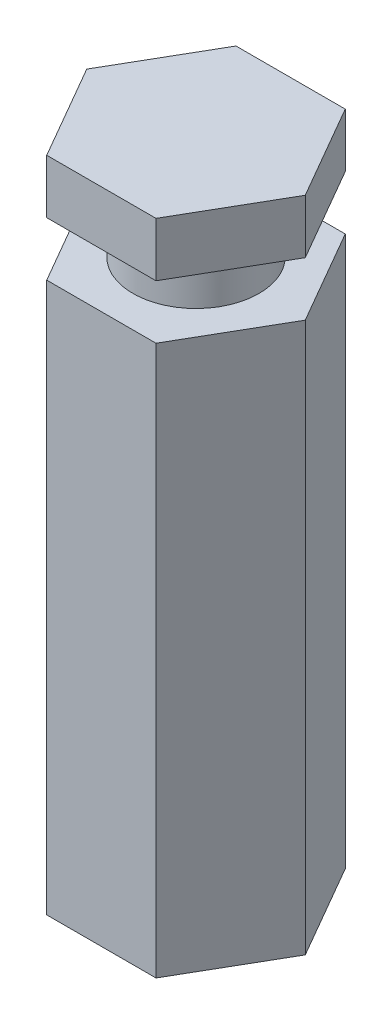
ISO-10303-21;
HEADER;
FILE_DESCRIPTION(('STEP AP214'),'2;1');
FILE_NAME('part.step','',(''),(''),'','','');
FILE_SCHEMA(('AUTOMOTIVE_DESIGN { 1 0 10303 214 1 1 1 1 }'));
ENDSEC;
DATA;
#1=APPLICATION_CONTEXT('core data for automotive mechanical design processes');
#2=APPLICATION_PROTOCOL_DEFINITION('international standard','automotive_design',2000,#1);
#3=PRODUCT_CONTEXT('',#1,'mechanical');
#4=PRODUCT('Part','Part','',(#3));
#5=PRODUCT_RELATED_PRODUCT_CATEGORY('part','',(#4));
#6=PRODUCT_DEFINITION_FORMATION('','',#4);
#7=PRODUCT_DEFINITION_CONTEXT('part definition',#1,'design');
#8=PRODUCT_DEFINITION('design','',#6,#7);
#9=PRODUCT_DEFINITION_SHAPE('','',#8);
#10=(LENGTH_UNIT() NAMED_UNIT(*) SI_UNIT(.MILLI.,.METRE.));
#11=(NAMED_UNIT(*) PLANE_ANGLE_UNIT() SI_UNIT($,.RADIAN.));
#12=(NAMED_UNIT(*) SI_UNIT($,.STERADIAN.) SOLID_ANGLE_UNIT());
#13=UNCERTAINTY_MEASURE_WITH_UNIT(LENGTH_MEASURE(1.E-05),#10,'distance_accuracy_value','');
#14=(GEOMETRIC_REPRESENTATION_CONTEXT(3) GLOBAL_UNCERTAINTY_ASSIGNED_CONTEXT((#13)) GLOBAL_UNIT_ASSIGNED_CONTEXT((#10,
#11,#12)) REPRESENTATION_CONTEXT('',''));
#15=CARTESIAN_POINT('',(0.,0.,0.));
#16=DIRECTION('',(0.,0.,1.));
#17=DIRECTION('',(1.,0.,0.));
#18=AXIS2_PLACEMENT_3D('',#15,#16,#17);
#19=CARTESIAN_POINT('',(0.,0.,0.));
#20=DIRECTION('',(0.,1.,0.));
#21=DIRECTION('',(0.,0.,1.));
#22=AXIS2_PLACEMENT_3D('',#19,#20,#21);
#23=PLANE('',#22);
#24=DIRECTION('',(1.,0.,0.));
#25=VECTOR('',#24,1.);
#26=CARTESIAN_POINT('',(1.09668965707812E-13,0.,10.4999999999999));
#27=LINE('',#26,#25);
#28=CARTESIAN_POINT('',(-6.06217782649094,0.,10.5));
#29=VERTEX_POINT('',#28);
#30=CARTESIAN_POINT('',(6.06217782649116,0.,10.4999999999999));
#31=VERTEX_POINT('',#30);
#32=EDGE_CURVE('E176',#29,#31,#27,.T.);
#33=ORIENTED_EDGE('',*,*,#32,.F.);
#34=DIRECTION('',(0.500000000000007,0.,0.866025403784435));
#35=VECTOR('',#34,1.);
#36=CARTESIAN_POINT('',(-9.09326673973651,0.,5.25000000000004));
#37=LINE('',#36,#35);
#38=CARTESIAN_POINT('',(-12.1243556529821,0.,0.));
#39=VERTEX_POINT('',#38);
#40=EDGE_CURVE('E195',#39,#29,#37,.T.);
#41=ORIENTED_EDGE('',*,*,#40,.F.);
#42=DIRECTION('',(-0.499999999999995,0.,0.866025403784442));
#43=VECTOR('',#42,1.);
#44=CARTESIAN_POINT('',(-9.09326673973659,0.,-5.24999999999992));
#45=LINE('',#44,#43);
#46=CARTESIAN_POINT('',(-6.06217782649109,0.,-10.4999999999999));
#47=VERTEX_POINT('',#46);
#48=EDGE_CURVE('E189',#47,#39,#45,.T.);
#49=ORIENTED_EDGE('',*,*,#48,.F.);
#50=DIRECTION('',(-1.,0.,0.));
#51=VECTOR('',#50,1.);
#52=CARTESIAN_POINT('',(0.,0.,-10.4999999999999));
#53=LINE('',#52,#51);
#54=CARTESIAN_POINT('',(6.06217782649102,0.,-10.5));
#55=VERTEX_POINT('',#54);
#56=EDGE_CURVE('E190',#55,#47,#53,.T.);
#57=ORIENTED_EDGE('',*,*,#56,.F.);
#58=DIRECTION('',(-0.500000000000001,0.,-0.866025403784438));
#59=VECTOR('',#58,1.);
#60=CARTESIAN_POINT('',(9.09326673973655,0.,-5.24999999999998));
#61=LINE('',#60,#59);
#62=CARTESIAN_POINT('',(12.1243556529821,0.,0.));
#63=VERTEX_POINT('',#62);
#64=EDGE_CURVE('E184',#63,#55,#61,.T.);
#65=ORIENTED_EDGE('',*,*,#64,.F.);
#66=DIRECTION('',(0.499999999999995,0.,-0.866025403784442));
#67=VECTOR('',#66,1.);
#68=CARTESIAN_POINT('',(9.09326673973663,0.,5.24999999999994));
#69=LINE('',#68,#67);
#70=EDGE_CURVE('E182',#31,#63,#69,.T.);
#71=ORIENTED_EDGE('',*,*,#70,.F.);
#72=EDGE_LOOP('',(#33,#41,#49,#57,#65,#71));
#73=FACE_BOUND('',#72,.T.);
#74=ADVANCED_FACE('F41',(#73),#23,.F.);
#75=CARTESIAN_POINT('',(-9.09326673973651,73.,5.25000000000004));
#76=DIRECTION('',(0.866025403784434,0.,-0.500000000000007));
#77=DIRECTION('',(-0.500000000000007,0.,-0.866025403784435));
#78=AXIS2_PLACEMENT_3D('',#75,#76,#77);
#79=PLANE('',#78);
#80=DIRECTION('',(0.,-1.,0.));
#81=VECTOR('',#80,1.);
#82=CARTESIAN_POINT('',(-6.06217782649094,73.,10.5));
#83=LINE('',#82,#81);
#84=CARTESIAN_POINT('',(-6.06217782649094,61.,10.5));
#85=VERTEX_POINT('',#84);
#86=EDGE_CURVE('E63',#85,#29,#83,.T.);
#87=ORIENTED_EDGE('',*,*,#86,.F.);
#88=DIRECTION('',(-0.500000000000007,0.,-0.866025403784435));
#89=VECTOR('',#88,1.);
#90=CARTESIAN_POINT('',(-9.09326673973651,61.,5.25000000000004));
#91=LINE('',#90,#89);
#92=CARTESIAN_POINT('',(-12.1243556529821,61.,0.));
#93=VERTEX_POINT('',#92);
#94=EDGE_CURVE('E47',#85,#93,#91,.T.);
#95=ORIENTED_EDGE('',*,*,#94,.T.);
#96=DIRECTION('',(0.,-1.,0.));
#97=VECTOR('',#96,1.);
#98=CARTESIAN_POINT('',(-12.1243556529821,73.,0.));
#99=LINE('',#98,#97);
#100=EDGE_CURVE('E198',#93,#39,#99,.T.);
#101=ORIENTED_EDGE('',*,*,#100,.T.);
#102=ORIENTED_EDGE('',*,*,#40,.T.);
#103=EDGE_LOOP('',(#87,#95,#101,#102));
#104=FACE_BOUND('',#103,.T.);
#105=ADVANCED_FACE('F210',(#104),#79,.F.);
#106=CARTESIAN_POINT('',(-9.09326673973659,73.,-5.24999999999992));
#107=DIRECTION('',(0.866025403784442,0.,0.499999999999995));
#108=DIRECTION('',(0.499999999999995,0.,-0.866025403784442));
#109=AXIS2_PLACEMENT_3D('',#106,#107,#108);
#110=PLANE('',#109);
#111=ORIENTED_EDGE('',*,*,#100,.F.);
#112=DIRECTION('',(0.499999999999995,0.,-0.866025403784442));
#113=VECTOR('',#112,1.);
#114=CARTESIAN_POINT('',(-9.09326673973659,61.,-5.24999999999992));
#115=LINE('',#114,#113);
#116=CARTESIAN_POINT('',(-6.06217782649109,61.,-10.4999999999999));
#117=VERTEX_POINT('',#116);
#118=EDGE_CURVE('E57',#93,#117,#115,.T.);
#119=ORIENTED_EDGE('',*,*,#118,.T.);
#120=DIRECTION('',(0.,-1.,0.));
#121=VECTOR('',#120,1.);
#122=CARTESIAN_POINT('',(-6.06217782649109,73.,-10.4999999999999));
#123=LINE('',#122,#121);
#124=EDGE_CURVE('E196',#117,#47,#123,.T.);
#125=ORIENTED_EDGE('',*,*,#124,.T.);
#126=ORIENTED_EDGE('',*,*,#48,.T.);
#127=EDGE_LOOP('',(#111,#119,#125,#126));
#128=FACE_BOUND('',#127,.T.);
#129=ADVANCED_FACE('F207',(#128),#110,.F.);
#130=CARTESIAN_POINT('',(0.,73.,-10.4999999999999));
#131=DIRECTION('',(0.,0.,1.));
#132=DIRECTION('',(1.,0.,0.));
#133=AXIS2_PLACEMENT_3D('',#130,#131,#132);
#134=PLANE('',#133);
#135=ORIENTED_EDGE('',*,*,#124,.F.);
#136=DIRECTION('',(1.,0.,0.));
#137=VECTOR('',#136,1.);
#138=CARTESIAN_POINT('',(0.,61.,-10.4999999999999));
#139=LINE('',#138,#137);
#140=CARTESIAN_POINT('',(6.06217782649102,61.,-10.5));
#141=VERTEX_POINT('',#140);
#142=EDGE_CURVE('E171',#117,#141,#139,.T.);
#143=ORIENTED_EDGE('',*,*,#142,.T.);
#144=DIRECTION('',(0.,-1.,0.));
#145=VECTOR('',#144,1.);
#146=CARTESIAN_POINT('',(6.06217782649102,73.,-10.5));
#147=LINE('',#146,#145);
#148=EDGE_CURVE('E199',#141,#55,#147,.T.);
#149=ORIENTED_EDGE('',*,*,#148,.T.);
#150=ORIENTED_EDGE('',*,*,#56,.T.);
#151=EDGE_LOOP('',(#135,#143,#149,#150));
#152=FACE_BOUND('',#151,.T.);
#153=ADVANCED_FACE('F227',(#152),#134,.F.);
#154=CARTESIAN_POINT('',(9.09326673973663,73.,5.24999999999994));
#155=DIRECTION('',(-0.866025403784441,0.,-0.499999999999995));
#156=DIRECTION('',(-0.499999999999995,0.,0.866025403784442));
#157=AXIS2_PLACEMENT_3D('',#154,#155,#156);
#158=PLANE('',#157);
#159=DIRECTION('',(0.,-1.,0.));
#160=VECTOR('',#159,1.);
#161=CARTESIAN_POINT('',(12.1243556529821,73.,0.));
#162=LINE('',#161,#160);
#163=CARTESIAN_POINT('',(12.1243556529821,61.,0.));
#164=VERTEX_POINT('',#163);
#165=EDGE_CURVE('E205',#164,#63,#162,.T.);
#166=ORIENTED_EDGE('',*,*,#165,.F.);
#167=DIRECTION('',(-0.499999999999995,0.,0.866025403784442));
#168=VECTOR('',#167,1.);
#169=CARTESIAN_POINT('',(9.09326673973663,61.,5.24999999999994));
#170=LINE('',#169,#168);
#171=CARTESIAN_POINT('',(6.06217782649116,61.,10.4999999999999));
#172=VERTEX_POINT('',#171);
#173=EDGE_CURVE('E177',#164,#172,#170,.T.);
#174=ORIENTED_EDGE('',*,*,#173,.T.);
#175=DIRECTION('',(0.,-1.,0.));
#176=VECTOR('',#175,1.);
#177=CARTESIAN_POINT('',(6.06217782649116,73.,10.4999999999999));
#178=LINE('',#177,#176);
#179=EDGE_CURVE('E204',#172,#31,#178,.T.);
#180=ORIENTED_EDGE('',*,*,#179,.T.);
#181=ORIENTED_EDGE('',*,*,#70,.T.);
#182=EDGE_LOOP('',(#166,#174,#180,#181));
#183=FACE_BOUND('',#182,.T.);
#184=ADVANCED_FACE('F222',(#183),#158,.F.);
#185=CARTESIAN_POINT('',(1.09668965707812E-13,73.,10.4999999999999));
#186=DIRECTION('',(0.,0.,-1.));
#187=DIRECTION('',(-1.,0.,0.));
#188=AXIS2_PLACEMENT_3D('',#185,#186,#187);
#189=PLANE('',#188);
#190=ORIENTED_EDGE('',*,*,#179,.F.);
#191=DIRECTION('',(-1.,0.,0.));
#192=VECTOR('',#191,1.);
#193=CARTESIAN_POINT('',(1.09668965707812E-13,61.,10.4999999999999));
#194=LINE('',#193,#192);
#195=EDGE_CURVE('E173',#172,#85,#194,.T.);
#196=ORIENTED_EDGE('',*,*,#195,.T.);
#197=ORIENTED_EDGE('',*,*,#86,.T.);
#198=ORIENTED_EDGE('',*,*,#32,.T.);
#199=EDGE_LOOP('',(#190,#196,#197,#198));
#200=FACE_BOUND('',#199,.T.);
#201=ADVANCED_FACE('F43',(#200),#189,.F.);
#202=CARTESIAN_POINT('',(9.09326673973655,73.,-5.24999999999998));
#203=DIRECTION('',(-0.866025403784438,0.,0.500000000000001));
#204=DIRECTION('',(0.500000000000001,0.,0.866025403784438));
#205=AXIS2_PLACEMENT_3D('',#202,#203,#204);
#206=PLANE('',#205);
#207=DIRECTION('',(-0.500000000000001,0.,-0.866025403784438));
#208=VECTOR('',#207,1.);
#209=CARTESIAN_POINT('',(24.2982835783559,61.,21.0858616944289));
#210=LINE('',#209,#208);
#211=EDGE_CURVE('E170',#164,#141,#210,.T.);
#212=ORIENTED_EDGE('',*,*,#211,.F.);
#213=ORIENTED_EDGE('',*,*,#165,.T.);
#214=ORIENTED_EDGE('',*,*,#64,.T.);
#215=ORIENTED_EDGE('',*,*,#148,.F.);
#216=EDGE_LOOP('',(#212,#213,#214,#215));
#217=FACE_BOUND('',#216,.T.);
#218=ADVANCED_FACE('F226',(#217),#206,.F.);
#219=CARTESIAN_POINT('',(-38.9215708979081,61.,57.5858616944289));
#220=DIRECTION('',(0.,-1.,0.));
#221=DIRECTION('',(0.,0.,-1.));
#222=AXIS2_PLACEMENT_3D('',#219,#220,#221);
#223=PLANE('',#222);
#224=CARTESIAN_POINT('',(0.,61.,0.));
#225=DIRECTION('',(0.,-1.,0.));
#226=DIRECTION('',(0.,0.,-1.));
#227=AXIS2_PLACEMENT_3D('',#224,#225,#226);
#228=CIRCLE('',#227,7.);
#229=CARTESIAN_POINT('',(0.,61.,-7.));
#230=VERTEX_POINT('',#229);
#231=EDGE_CURVE('E11',#230,#230,#228,.F.);
#232=ORIENTED_EDGE('',*,*,#231,.F.);
#233=EDGE_LOOP('',(#232));
#234=FACE_BOUND('',#233,.T.);
#235=ORIENTED_EDGE('',*,*,#211,.T.);
#236=ORIENTED_EDGE('',*,*,#142,.F.);
#237=ORIENTED_EDGE('',*,*,#118,.F.);
#238=ORIENTED_EDGE('',*,*,#94,.F.);
#239=ORIENTED_EDGE('',*,*,#195,.F.);
#240=ORIENTED_EDGE('',*,*,#173,.F.);
#241=EDGE_LOOP('',(#235,#236,#237,#238,#239,#240));
#242=FACE_BOUND('',#241,.T.);
#243=ADVANCED_FACE('F224',(#234,#242),#223,.F.);
#244=CARTESIAN_POINT('',(0.,67.,0.));
#245=DIRECTION('',(0.,-1.,0.));
#246=DIRECTION('',(0.,0.,-1.));
#247=AXIS2_PLACEMENT_3D('',#244,#245,#246);
#248=CYLINDRICAL_SURFACE('',#247,7.);
#249=CARTESIAN_POINT('',(0.,67.,0.));
#250=DIRECTION('',(0.,1.,0.));
#251=DIRECTION('',(0.,0.,1.));
#252=AXIS2_PLACEMENT_3D('',#249,#250,#251);
#253=CIRCLE('',#252,7.);
#254=CARTESIAN_POINT('',(0.,67.,7.));
#255=VERTEX_POINT('',#254);
#256=EDGE_CURVE('E163',#255,#255,#253,.T.);
#257=ORIENTED_EDGE('',*,*,#256,.F.);
#258=EDGE_LOOP('',(#257));
#259=FACE_BOUND('',#258,.T.);
#260=ORIENTED_EDGE('',*,*,#231,.T.);
#261=EDGE_LOOP('',(#260));
#262=FACE_BOUND('',#261,.T.);
#263=ADVANCED_FACE('F249',(#259,#262),#248,.T.);
#264=CARTESIAN_POINT('',(9.09326673973655,73.,-5.24999999999998));
#265=DIRECTION('',(-0.866025403784438,0.,0.500000000000001));
#266=DIRECTION('',(0.500000000000001,0.,0.866025403784438));
#267=AXIS2_PLACEMENT_3D('',#264,#265,#266);
#268=PLANE('',#267);
#269=DIRECTION('',(0.500000000000001,0.,0.866025403784438));
#270=VECTOR('',#269,1.);
#271=CARTESIAN_POINT('',(24.2982835783559,67.,21.0858616944289));
#272=LINE('',#271,#270);
#273=CARTESIAN_POINT('',(6.06217782649102,67.,-10.5));
#274=VERTEX_POINT('',#273);
#275=CARTESIAN_POINT('',(12.1243556529821,67.,0.));
#276=VERTEX_POINT('',#275);
#277=EDGE_CURVE('E169',#274,#276,#272,.T.);
#278=ORIENTED_EDGE('',*,*,#277,.F.);
#279=DIRECTION('',(0.,-1.,0.));
#280=VECTOR('',#279,1.);
#281=CARTESIAN_POINT('',(6.06217782649102,73.,-10.5));
#282=LINE('',#281,#280);
#283=CARTESIAN_POINT('',(6.06217782649102,73.,-10.5));
#284=VERTEX_POINT('',#283);
#285=EDGE_CURVE('E284',#284,#274,#282,.T.);
#286=ORIENTED_EDGE('',*,*,#285,.F.);
#287=DIRECTION('',(-0.500000000000001,0.,-0.866025403784438));
#288=VECTOR('',#287,1.);
#289=CARTESIAN_POINT('',(9.09326673973655,73.,-5.24999999999998));
#290=LINE('',#289,#288);
#291=CARTESIAN_POINT('',(12.1243556529821,73.,0.));
#292=VERTEX_POINT('',#291);
#293=EDGE_CURVE('E302',#292,#284,#290,.T.);
#294=ORIENTED_EDGE('',*,*,#293,.F.);
#295=DIRECTION('',(0.,-1.,0.));
#296=VECTOR('',#295,1.);
#297=CARTESIAN_POINT('',(12.1243556529821,73.,0.));
#298=LINE('',#297,#296);
#299=EDGE_CURVE('E160',#292,#276,#298,.T.);
#300=ORIENTED_EDGE('',*,*,#299,.T.);
#301=EDGE_LOOP('',(#278,#286,#294,#300));
#302=FACE_BOUND('',#301,.T.);
#303=ADVANCED_FACE('F253',(#302),#268,.F.);
#304=CARTESIAN_POINT('',(1.09668965707812E-13,73.,10.4999999999999));
#305=DIRECTION('',(0.,0.,-1.));
#306=DIRECTION('',(-1.,0.,0.));
#307=AXIS2_PLACEMENT_3D('',#304,#305,#306);
#308=PLANE('',#307);
#309=DIRECTION('',(0.,-1.,0.));
#310=VECTOR('',#309,1.);
#311=CARTESIAN_POINT('',(-6.06217782649094,73.,10.5));
#312=LINE('',#311,#310);
#313=CARTESIAN_POINT('',(-6.06217782649094,73.,10.5));
#314=VERTEX_POINT('',#313);
#315=CARTESIAN_POINT('',(-6.06217782649094,67.,10.5));
#316=VERTEX_POINT('',#315);
#317=EDGE_CURVE('E141',#314,#316,#312,.T.);
#318=ORIENTED_EDGE('',*,*,#317,.T.);
#319=DIRECTION('',(1.,0.,0.));
#320=VECTOR('',#319,1.);
#321=CARTESIAN_POINT('',(1.09668965707812E-13,67.,10.4999999999999));
#322=LINE('',#321,#320);
#323=CARTESIAN_POINT('',(6.06217782649116,67.,10.4999999999999));
#324=VERTEX_POINT('',#323);
#325=EDGE_CURVE('E131',#316,#324,#322,.T.);
#326=ORIENTED_EDGE('',*,*,#325,.T.);
#327=DIRECTION('',(0.,-1.,0.));
#328=VECTOR('',#327,1.);
#329=CARTESIAN_POINT('',(6.06217782649116,73.,10.4999999999999));
#330=LINE('',#329,#328);
#331=CARTESIAN_POINT('',(6.06217782649116,73.,10.4999999999999));
#332=VERTEX_POINT('',#331);
#333=EDGE_CURVE('E142',#332,#324,#330,.T.);
#334=ORIENTED_EDGE('',*,*,#333,.F.);
#335=DIRECTION('',(1.,0.,0.));
#336=VECTOR('',#335,1.);
#337=CARTESIAN_POINT('',(1.09668965707812E-13,73.,10.4999999999999));
#338=LINE('',#337,#336);
#339=EDGE_CURVE('E153',#314,#332,#338,.T.);
#340=ORIENTED_EDGE('',*,*,#339,.F.);
#341=EDGE_LOOP('',(#318,#326,#334,#340));
#342=FACE_BOUND('',#341,.T.);
#343=ADVANCED_FACE('F154',(#342),#308,.F.);
#344=CARTESIAN_POINT('',(9.09326673973663,73.,5.24999999999994));
#345=DIRECTION('',(-0.866025403784441,0.,-0.499999999999995));
#346=DIRECTION('',(-0.499999999999995,0.,0.866025403784442));
#347=AXIS2_PLACEMENT_3D('',#344,#345,#346);
#348=PLANE('',#347);
#349=ORIENTED_EDGE('',*,*,#333,.T.);
#350=DIRECTION('',(0.499999999999995,0.,-0.866025403784442));
#351=VECTOR('',#350,1.);
#352=CARTESIAN_POINT('',(9.09326673973663,67.,5.24999999999994));
#353=LINE('',#352,#351);
#354=EDGE_CURVE('E139',#324,#276,#353,.T.);
#355=ORIENTED_EDGE('',*,*,#354,.T.);
#356=ORIENTED_EDGE('',*,*,#299,.F.);
#357=DIRECTION('',(0.499999999999995,0.,-0.866025403784442));
#358=VECTOR('',#357,1.);
#359=CARTESIAN_POINT('',(9.09326673973663,73.,5.24999999999994));
#360=LINE('',#359,#358);
#361=EDGE_CURVE('E278',#332,#292,#360,.T.);
#362=ORIENTED_EDGE('',*,*,#361,.F.);
#363=EDGE_LOOP('',(#349,#355,#356,#362));
#364=FACE_BOUND('',#363,.T.);
#365=ADVANCED_FACE('F256',(#364),#348,.F.);
#366=CARTESIAN_POINT('',(0.,73.,-10.4999999999999));
#367=DIRECTION('',(0.,0.,1.));
#368=DIRECTION('',(1.,0.,0.));
#369=AXIS2_PLACEMENT_3D('',#366,#367,#368);
#370=PLANE('',#369);
#371=ORIENTED_EDGE('',*,*,#285,.T.);
#372=DIRECTION('',(-1.,0.,0.));
#373=VECTOR('',#372,1.);
#374=CARTESIAN_POINT('',(0.,67.,-10.4999999999999));
#375=LINE('',#374,#373);
#376=CARTESIAN_POINT('',(-6.06217782649109,67.,-10.4999999999999));
#377=VERTEX_POINT('',#376);
#378=EDGE_CURVE('E292',#274,#377,#375,.T.);
#379=ORIENTED_EDGE('',*,*,#378,.T.);
#380=DIRECTION('',(0.,-1.,0.));
#381=VECTOR('',#380,1.);
#382=CARTESIAN_POINT('',(-6.06217782649109,73.,-10.4999999999999));
#383=LINE('',#382,#381);
#384=CARTESIAN_POINT('',(-6.06217782649109,73.,-10.4999999999999));
#385=VERTEX_POINT('',#384);
#386=EDGE_CURVE('E295',#385,#377,#383,.T.);
#387=ORIENTED_EDGE('',*,*,#386,.F.);
#388=DIRECTION('',(-1.,0.,0.));
#389=VECTOR('',#388,1.);
#390=CARTESIAN_POINT('',(0.,73.,-10.4999999999999));
#391=LINE('',#390,#389);
#392=EDGE_CURVE('E305',#284,#385,#391,.T.);
#393=ORIENTED_EDGE('',*,*,#392,.F.);
#394=EDGE_LOOP('',(#371,#379,#387,#393));
#395=FACE_BOUND('',#394,.T.);
#396=ADVANCED_FACE('F261',(#395),#370,.F.);
#397=CARTESIAN_POINT('',(-9.09326673973659,73.,-5.24999999999992));
#398=DIRECTION('',(0.866025403784442,0.,0.499999999999995));
#399=DIRECTION('',(0.499999999999995,0.,-0.866025403784442));
#400=AXIS2_PLACEMENT_3D('',#397,#398,#399);
#401=PLANE('',#400);
#402=ORIENTED_EDGE('',*,*,#386,.T.);
#403=DIRECTION('',(-0.499999999999995,0.,0.866025403784442));
#404=VECTOR('',#403,1.);
#405=CARTESIAN_POINT('',(-9.09326673973659,67.,-5.24999999999992));
#406=LINE('',#405,#404);
#407=CARTESIAN_POINT('',(-12.1243556529821,67.,0.));
#408=VERTEX_POINT('',#407);
#409=EDGE_CURVE('E294',#377,#408,#406,.T.);
#410=ORIENTED_EDGE('',*,*,#409,.T.);
#411=DIRECTION('',(0.,-1.,0.));
#412=VECTOR('',#411,1.);
#413=CARTESIAN_POINT('',(-12.1243556529821,73.,0.));
#414=LINE('',#413,#412);
#415=CARTESIAN_POINT('',(-12.1243556529821,73.,0.));
#416=VERTEX_POINT('',#415);
#417=EDGE_CURVE('E155',#416,#408,#414,.T.);
#418=ORIENTED_EDGE('',*,*,#417,.F.);
#419=DIRECTION('',(-0.499999999999995,0.,0.866025403784442));
#420=VECTOR('',#419,1.);
#421=CARTESIAN_POINT('',(-9.09326673973659,73.,-5.24999999999992));
#422=LINE('',#421,#420);
#423=EDGE_CURVE('E303',#385,#416,#422,.T.);
#424=ORIENTED_EDGE('',*,*,#423,.F.);
#425=EDGE_LOOP('',(#402,#410,#418,#424));
#426=FACE_BOUND('',#425,.T.);
#427=ADVANCED_FACE('F264',(#426),#401,.F.);
#428=CARTESIAN_POINT('',(-9.09326673973651,73.,5.25000000000004));
#429=DIRECTION('',(0.866025403784434,0.,-0.500000000000007));
#430=DIRECTION('',(-0.500000000000007,0.,-0.866025403784435));
#431=AXIS2_PLACEMENT_3D('',#428,#429,#430);
#432=PLANE('',#431);
#433=ORIENTED_EDGE('',*,*,#417,.T.);
#434=DIRECTION('',(0.500000000000007,0.,0.866025403784435));
#435=VECTOR('',#434,1.);
#436=CARTESIAN_POINT('',(-9.09326673973651,67.,5.25000000000004));
#437=LINE('',#436,#435);
#438=EDGE_CURVE('E133',#408,#316,#437,.T.);
#439=ORIENTED_EDGE('',*,*,#438,.T.);
#440=ORIENTED_EDGE('',*,*,#317,.F.);
#441=DIRECTION('',(0.500000000000007,0.,0.866025403784435));
#442=VECTOR('',#441,1.);
#443=CARTESIAN_POINT('',(-9.09326673973651,73.,5.25000000000004));
#444=LINE('',#443,#442);
#445=EDGE_CURVE('E285',#416,#314,#444,.T.);
#446=ORIENTED_EDGE('',*,*,#445,.F.);
#447=EDGE_LOOP('',(#433,#439,#440,#446));
#448=FACE_BOUND('',#447,.T.);
#449=ADVANCED_FACE('F146',(#448),#432,.F.);
#450=CARTESIAN_POINT('',(0.,73.,0.));
#451=DIRECTION('',(0.,1.,0.));
#452=DIRECTION('',(0.,0.,1.));
#453=AXIS2_PLACEMENT_3D('',#450,#451,#452);
#454=PLANE('',#453);
#455=ORIENTED_EDGE('',*,*,#339,.T.);
#456=ORIENTED_EDGE('',*,*,#361,.T.);
#457=ORIENTED_EDGE('',*,*,#293,.T.);
#458=ORIENTED_EDGE('',*,*,#392,.T.);
#459=ORIENTED_EDGE('',*,*,#423,.T.);
#460=ORIENTED_EDGE('',*,*,#445,.T.);
#461=EDGE_LOOP('',(#455,#456,#457,#458,#459,#460));
#462=FACE_BOUND('',#461,.T.);
#463=ADVANCED_FACE('F275',(#462),#454,.T.);
#464=CARTESIAN_POINT('',(-38.9215708979081,67.,57.5858616944289));
#465=DIRECTION('',(0.,1.,0.));
#466=DIRECTION('',(0.,0.,1.));
#467=AXIS2_PLACEMENT_3D('',#464,#465,#466);
#468=PLANE('',#467);
#469=ORIENTED_EDGE('',*,*,#256,.T.);
#470=EDGE_LOOP('',(#469));
#471=FACE_BOUND('',#470,.T.);
#472=ORIENTED_EDGE('',*,*,#325,.F.);
#473=ORIENTED_EDGE('',*,*,#438,.F.);
#474=ORIENTED_EDGE('',*,*,#409,.F.);
#475=ORIENTED_EDGE('',*,*,#378,.F.);
#476=ORIENTED_EDGE('',*,*,#277,.T.);
#477=ORIENTED_EDGE('',*,*,#354,.F.);
#478=EDGE_LOOP('',(#472,#473,#474,#475,#476,#477));
#479=FACE_BOUND('',#478,.T.);
#480=ADVANCED_FACE('F132',(#471,#479),#468,.F.);
#481=CLOSED_SHELL('',(#74,#105,#129,#153,#184,#201,#218,#243,#263,#303,#343,#365,#396,#427,#449,
#463,#480));
#482=MANIFOLD_SOLID_BREP('B2',#481);
#483=ADVANCED_BREP_SHAPE_REPRESENTATION('',(#18,#482),#14);
#484=SHAPE_DEFINITION_REPRESENTATION(#9,#483);
ENDSEC;
END-ISO-10303-21;
